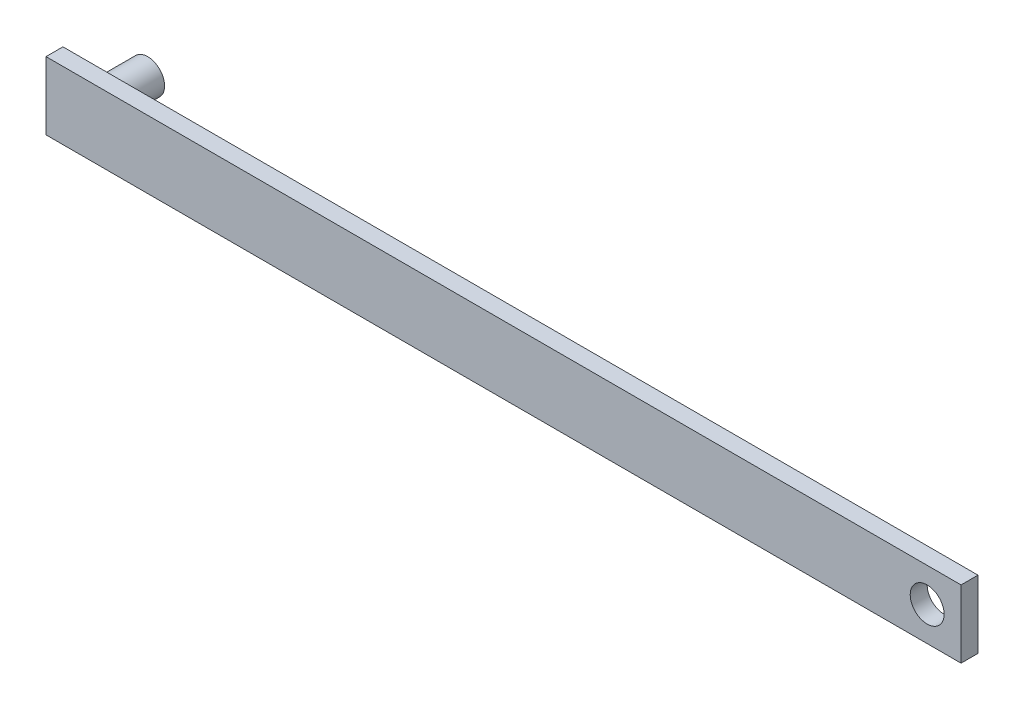
ISO-10303-21;
HEADER;
FILE_DESCRIPTION(('STEP AP214'),'2;1');
FILE_NAME('part.step','',(''),(''),'','','');
FILE_SCHEMA(('AUTOMOTIVE_DESIGN { 1 0 10303 214 1 1 1 1 }'));
ENDSEC;
DATA;
#1=APPLICATION_CONTEXT('core data for automotive mechanical design processes');
#2=APPLICATION_PROTOCOL_DEFINITION('international standard','automotive_design',2000,#1);
#3=PRODUCT_CONTEXT('',#1,'mechanical');
#4=PRODUCT('Part','Part','',(#3));
#5=PRODUCT_RELATED_PRODUCT_CATEGORY('part','',(#4));
#6=PRODUCT_DEFINITION_FORMATION('','',#4);
#7=PRODUCT_DEFINITION_CONTEXT('part definition',#1,'design');
#8=PRODUCT_DEFINITION('design','',#6,#7);
#9=PRODUCT_DEFINITION_SHAPE('','',#8);
#10=(LENGTH_UNIT() NAMED_UNIT(*) SI_UNIT(.MILLI.,.METRE.));
#11=(NAMED_UNIT(*) PLANE_ANGLE_UNIT() SI_UNIT($,.RADIAN.));
#12=(NAMED_UNIT(*) SI_UNIT($,.STERADIAN.) SOLID_ANGLE_UNIT());
#13=UNCERTAINTY_MEASURE_WITH_UNIT(LENGTH_MEASURE(1.E-05),#10,'distance_accuracy_value','');
#14=(GEOMETRIC_REPRESENTATION_CONTEXT(3) GLOBAL_UNCERTAINTY_ASSIGNED_CONTEXT((#13)) GLOBAL_UNIT_ASSIGNED_CONTEXT((#10,
#11,#12)) REPRESENTATION_CONTEXT('',''));
#15=CARTESIAN_POINT('',(0.,0.,0.));
#16=DIRECTION('',(0.,0.,1.));
#17=DIRECTION('',(1.,0.,0.));
#18=AXIS2_PLACEMENT_3D('',#15,#16,#17);
#19=CARTESIAN_POINT('',(135.,10.,5.));
#20=DIRECTION('',(-1.,0.,0.));
#21=DIRECTION('',(0.,0.,1.));
#22=AXIS2_PLACEMENT_3D('',#19,#20,#21);
#23=PLANE('',#22);
#24=DIRECTION('',(0.,1.,0.));
#25=VECTOR('',#24,1.);
#26=CARTESIAN_POINT('',(135.,10.,0.));
#27=LINE('',#26,#25);
#28=CARTESIAN_POINT('',(135.,-10.,0.));
#29=VERTEX_POINT('',#28);
#30=CARTESIAN_POINT('',(135.,10.,0.));
#31=VERTEX_POINT('',#30);
#32=EDGE_CURVE('E99',#29,#31,#27,.T.);
#33=ORIENTED_EDGE('',*,*,#32,.T.);
#34=DIRECTION('',(0.,0.,-1.));
#35=VECTOR('',#34,1.);
#36=CARTESIAN_POINT('',(135.,10.,5.));
#37=LINE('',#36,#35);
#38=CARTESIAN_POINT('',(135.,10.,5.));
#39=VERTEX_POINT('',#38);
#40=EDGE_CURVE('E41',#39,#31,#37,.T.);
#41=ORIENTED_EDGE('',*,*,#40,.F.);
#42=DIRECTION('',(0.,1.,0.));
#43=VECTOR('',#42,1.);
#44=CARTESIAN_POINT('',(135.,10.,5.));
#45=LINE('',#44,#43);
#46=CARTESIAN_POINT('',(135.,-10.,5.));
#47=VERTEX_POINT('',#46);
#48=EDGE_CURVE('E85',#47,#39,#45,.T.);
#49=ORIENTED_EDGE('',*,*,#48,.F.);
#50=DIRECTION('',(0.,0.,-1.));
#51=VECTOR('',#50,1.);
#52=CARTESIAN_POINT('',(135.,-10.,5.));
#53=LINE('',#52,#51);
#54=EDGE_CURVE('E95',#47,#29,#53,.T.);
#55=ORIENTED_EDGE('',*,*,#54,.T.);
#56=EDGE_LOOP('',(#33,#41,#49,#55));
#57=FACE_BOUND('',#56,.T.);
#58=ADVANCED_FACE('F33',(#57),#23,.F.);
#59=CARTESIAN_POINT('',(-135.,10.,5.));
#60=DIRECTION('',(0.,-1.,0.));
#61=DIRECTION('',(1.,0.,0.));
#62=AXIS2_PLACEMENT_3D('',#59,#60,#61);
#63=PLANE('',#62);
#64=DIRECTION('',(-1.,0.,0.));
#65=VECTOR('',#64,1.);
#66=CARTESIAN_POINT('',(-135.,10.,0.));
#67=LINE('',#66,#65);
#68=CARTESIAN_POINT('',(-135.,10.,0.));
#69=VERTEX_POINT('',#68);
#70=EDGE_CURVE('E90',#31,#69,#67,.T.);
#71=ORIENTED_EDGE('',*,*,#70,.T.);
#72=DIRECTION('',(0.,0.,-1.));
#73=VECTOR('',#72,1.);
#74=CARTESIAN_POINT('',(-135.,10.,5.));
#75=LINE('',#74,#73);
#76=CARTESIAN_POINT('',(-135.,10.,5.));
#77=VERTEX_POINT('',#76);
#78=EDGE_CURVE('E88',#77,#69,#75,.T.);
#79=ORIENTED_EDGE('',*,*,#78,.F.);
#80=DIRECTION('',(-1.,0.,0.));
#81=VECTOR('',#80,1.);
#82=CARTESIAN_POINT('',(-135.,10.,5.));
#83=LINE('',#82,#81);
#84=EDGE_CURVE('E80',#39,#77,#83,.T.);
#85=ORIENTED_EDGE('',*,*,#84,.F.);
#86=ORIENTED_EDGE('',*,*,#40,.T.);
#87=EDGE_LOOP('',(#71,#79,#85,#86));
#88=FACE_BOUND('',#87,.T.);
#89=ADVANCED_FACE('F89',(#88),#63,.F.);
#90=CARTESIAN_POINT('',(-135.,10.,5.));
#91=DIRECTION('',(1.,0.,0.));
#92=DIRECTION('',(0.,0.,-1.));
#93=AXIS2_PLACEMENT_3D('',#90,#91,#92);
#94=PLANE('',#93);
#95=DIRECTION('',(0.,-1.,0.));
#96=VECTOR('',#95,1.);
#97=CARTESIAN_POINT('',(-135.,10.,0.));
#98=LINE('',#97,#96);
#99=CARTESIAN_POINT('',(-135.,-10.,0.));
#100=VERTEX_POINT('',#99);
#101=EDGE_CURVE('E66',#69,#100,#98,.T.);
#102=ORIENTED_EDGE('',*,*,#101,.T.);
#103=DIRECTION('',(0.,0.,-1.));
#104=VECTOR('',#103,1.);
#105=CARTESIAN_POINT('',(-135.,-10.,5.));
#106=LINE('',#105,#104);
#107=CARTESIAN_POINT('',(-135.,-10.,5.));
#108=VERTEX_POINT('',#107);
#109=EDGE_CURVE('E91',#108,#100,#106,.T.);
#110=ORIENTED_EDGE('',*,*,#109,.F.);
#111=DIRECTION('',(0.,-1.,0.));
#112=VECTOR('',#111,1.);
#113=CARTESIAN_POINT('',(-135.,10.,5.));
#114=LINE('',#113,#112);
#115=EDGE_CURVE('E83',#77,#108,#114,.T.);
#116=ORIENTED_EDGE('',*,*,#115,.F.);
#117=ORIENTED_EDGE('',*,*,#78,.T.);
#118=EDGE_LOOP('',(#102,#110,#116,#117));
#119=FACE_BOUND('',#118,.T.);
#120=ADVANCED_FACE('F93',(#119),#94,.F.);
#121=CARTESIAN_POINT('',(-135.,-10.,5.));
#122=DIRECTION('',(0.,1.,0.));
#123=DIRECTION('',(0.,0.,1.));
#124=AXIS2_PLACEMENT_3D('',#121,#122,#123);
#125=PLANE('',#124);
#126=DIRECTION('',(1.,0.,0.));
#127=VECTOR('',#126,1.);
#128=CARTESIAN_POINT('',(-135.,-10.,0.));
#129=LINE('',#128,#127);
#130=EDGE_CURVE('E72',#100,#29,#129,.T.);
#131=ORIENTED_EDGE('',*,*,#130,.T.);
#132=ORIENTED_EDGE('',*,*,#54,.F.);
#133=DIRECTION('',(1.,0.,0.));
#134=VECTOR('',#133,1.);
#135=CARTESIAN_POINT('',(-135.,-10.,5.));
#136=LINE('',#135,#134);
#137=EDGE_CURVE('E49',#108,#47,#136,.T.);
#138=ORIENTED_EDGE('',*,*,#137,.F.);
#139=ORIENTED_EDGE('',*,*,#109,.T.);
#140=EDGE_LOOP('',(#131,#132,#138,#139));
#141=FACE_BOUND('',#140,.T.);
#142=ADVANCED_FACE('F122',(#141),#125,.F.);
#143=CARTESIAN_POINT('',(0.,0.,5.));
#144=DIRECTION('',(0.,0.,1.));
#145=DIRECTION('',(1.,0.,0.));
#146=AXIS2_PLACEMENT_3D('',#143,#144,#145);
#147=PLANE('',#146);
#148=CARTESIAN_POINT('',(125.,0.,5.));
#149=DIRECTION('',(0.,0.,-1.));
#150=DIRECTION('',(-1.,0.,0.));
#151=AXIS2_PLACEMENT_3D('',#148,#149,#150);
#152=CIRCLE('',#151,5.);
#153=CARTESIAN_POINT('',(120.,0.,5.));
#154=VERTEX_POINT('',#153);
#155=EDGE_CURVE('E102',#154,#154,#152,.T.);
#156=ORIENTED_EDGE('',*,*,#155,.T.);
#157=EDGE_LOOP('',(#156));
#158=FACE_BOUND('',#157,.T.);
#159=ORIENTED_EDGE('',*,*,#48,.T.);
#160=ORIENTED_EDGE('',*,*,#84,.T.);
#161=ORIENTED_EDGE('',*,*,#115,.T.);
#162=ORIENTED_EDGE('',*,*,#137,.T.);
#163=EDGE_LOOP('',(#159,#160,#161,#162));
#164=FACE_BOUND('',#163,.T.);
#165=ADVANCED_FACE('F81',(#158,#164),#147,.T.);
#166=CARTESIAN_POINT('',(0.,0.,0.));
#167=DIRECTION('',(0.,0.,1.));
#168=DIRECTION('',(1.,0.,0.));
#169=AXIS2_PLACEMENT_3D('',#166,#167,#168);
#170=PLANE('',#169);
#171=CARTESIAN_POINT('',(-125.,0.,0.));
#172=DIRECTION('',(0.,0.,1.));
#173=DIRECTION('',(1.,0.,0.));
#174=AXIS2_PLACEMENT_3D('',#171,#172,#173);
#175=CIRCLE('',#174,4.99999999999999);
#176=CARTESIAN_POINT('',(-120.,0.,0.));
#177=VERTEX_POINT('',#176);
#178=EDGE_CURVE('E11',#177,#177,#175,.F.);
#179=ORIENTED_EDGE('',*,*,#178,.F.);
#180=EDGE_LOOP('',(#179));
#181=FACE_BOUND('',#180,.T.);
#182=CARTESIAN_POINT('',(125.,0.,0.));
#183=DIRECTION('',(0.,0.,-1.));
#184=DIRECTION('',(-1.,0.,0.));
#185=AXIS2_PLACEMENT_3D('',#182,#183,#184);
#186=CIRCLE('',#185,5.);
#187=CARTESIAN_POINT('',(120.,0.,0.));
#188=VERTEX_POINT('',#187);
#189=EDGE_CURVE('E181',#188,#188,#186,.T.);
#190=ORIENTED_EDGE('',*,*,#189,.F.);
#191=EDGE_LOOP('',(#190));
#192=FACE_BOUND('',#191,.T.);
#193=ORIENTED_EDGE('',*,*,#32,.F.);
#194=ORIENTED_EDGE('',*,*,#130,.F.);
#195=ORIENTED_EDGE('',*,*,#101,.F.);
#196=ORIENTED_EDGE('',*,*,#70,.F.);
#197=EDGE_LOOP('',(#193,#194,#195,#196));
#198=FACE_BOUND('',#197,.T.);
#199=ADVANCED_FACE('F110',(#181,#192,#198),#170,.F.);
#200=CARTESIAN_POINT('',(125.,0.,5.));
#201=DIRECTION('',(0.,0.,-1.));
#202=DIRECTION('',(-1.,0.,0.));
#203=AXIS2_PLACEMENT_3D('',#200,#201,#202);
#204=CYLINDRICAL_SURFACE('',#203,5.);
#205=ORIENTED_EDGE('',*,*,#155,.F.);
#206=EDGE_LOOP('',(#205));
#207=FACE_BOUND('',#206,.T.);
#208=ORIENTED_EDGE('',*,*,#189,.T.);
#209=EDGE_LOOP('',(#208));
#210=FACE_BOUND('',#209,.T.);
#211=ADVANCED_FACE('F112',(#207,#210),#204,.F.);
#212=CARTESIAN_POINT('',(-125.,0.,-15.));
#213=DIRECTION('',(0.,0.,1.));
#214=DIRECTION('',(1.,0.,0.));
#215=AXIS2_PLACEMENT_3D('',#212,#213,#214);
#216=CYLINDRICAL_SURFACE('',#215,4.99999999999999);
#217=CARTESIAN_POINT('',(-125.,0.,-15.));
#218=DIRECTION('',(0.,0.,-1.));
#219=DIRECTION('',(-1.,0.,0.));
#220=AXIS2_PLACEMENT_3D('',#217,#218,#219);
#221=CIRCLE('',#220,4.99999999999999);
#222=CARTESIAN_POINT('',(-130.,0.,-15.));
#223=VERTEX_POINT('',#222);
#224=EDGE_CURVE('E180',#223,#223,#221,.T.);
#225=ORIENTED_EDGE('',*,*,#224,.F.);
#226=EDGE_LOOP('',(#225));
#227=FACE_BOUND('',#226,.T.);
#228=ORIENTED_EDGE('',*,*,#178,.T.);
#229=EDGE_LOOP('',(#228));
#230=FACE_BOUND('',#229,.T.);
#231=ADVANCED_FACE('F119',(#227,#230),#216,.T.);
#232=CARTESIAN_POINT('',(-125.,0.,-15.));
#233=DIRECTION('',(0.,0.,-1.));
#234=DIRECTION('',(-1.,0.,0.));
#235=AXIS2_PLACEMENT_3D('',#232,#233,#234);
#236=PLANE('',#235);
#237=ORIENTED_EDGE('',*,*,#224,.T.);
#238=EDGE_LOOP('',(#237));
#239=FACE_BOUND('',#238,.T.);
#240=ADVANCED_FACE('F164',(#239),#236,.T.);
#241=CLOSED_SHELL('',(#58,#89,#120,#142,#165,#199,#211,#231,#240));
#242=MANIFOLD_SOLID_BREP('B2',#241);
#243=ADVANCED_BREP_SHAPE_REPRESENTATION('',(#18,#242),#14);
#244=SHAPE_DEFINITION_REPRESENTATION(#9,#243);
ENDSEC;
END-ISO-10303-21;
